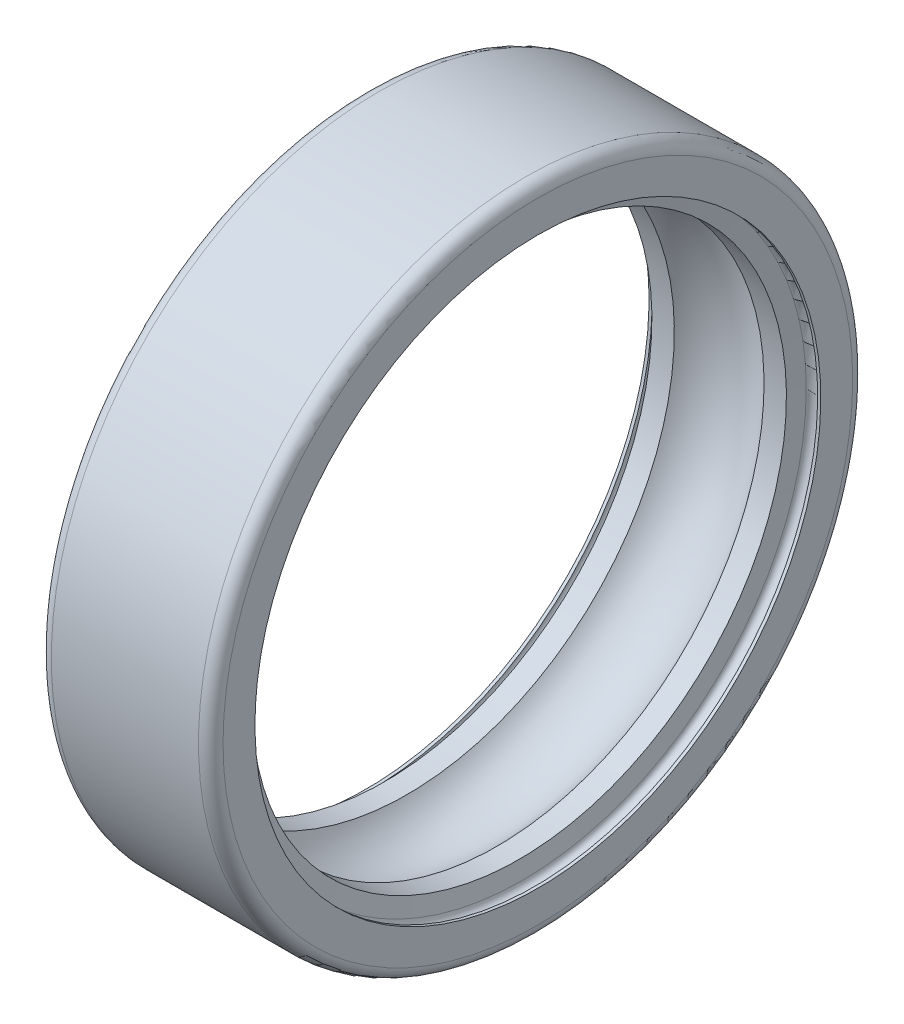
ISO-10303-21;
HEADER;
FILE_DESCRIPTION(('STEP AP214'),'2;1');
FILE_NAME('part.step','',(''),(''),'','','');
FILE_SCHEMA(('AUTOMOTIVE_DESIGN { 1 0 10303 214 1 1 1 1 }'));
ENDSEC;
DATA;
#1=APPLICATION_CONTEXT('core data for automotive mechanical design processes');
#2=APPLICATION_PROTOCOL_DEFINITION('international standard','automotive_design',2000,#1);
#3=PRODUCT_CONTEXT('',#1,'mechanical');
#4=PRODUCT('Part','Part','',(#3));
#5=PRODUCT_RELATED_PRODUCT_CATEGORY('part','',(#4));
#6=PRODUCT_DEFINITION_FORMATION('','',#4);
#7=PRODUCT_DEFINITION_CONTEXT('part definition',#1,'design');
#8=PRODUCT_DEFINITION('design','',#6,#7);
#9=PRODUCT_DEFINITION_SHAPE('','',#8);
#10=(LENGTH_UNIT() NAMED_UNIT(*) SI_UNIT(.MILLI.,.METRE.));
#11=(NAMED_UNIT(*) PLANE_ANGLE_UNIT() SI_UNIT($,.RADIAN.));
#12=(NAMED_UNIT(*) SI_UNIT($,.STERADIAN.) SOLID_ANGLE_UNIT());
#13=UNCERTAINTY_MEASURE_WITH_UNIT(LENGTH_MEASURE(1.E-05),#10,'distance_accuracy_value','');
#14=(GEOMETRIC_REPRESENTATION_CONTEXT(3) GLOBAL_UNCERTAINTY_ASSIGNED_CONTEXT((#13)) GLOBAL_UNIT_ASSIGNED_CONTEXT((#10,
#11,#12)) REPRESENTATION_CONTEXT('',''));
#15=CARTESIAN_POINT('',(0.,0.,0.));
#16=DIRECTION('',(0.,0.,1.));
#17=DIRECTION('',(1.,0.,0.));
#18=AXIS2_PLACEMENT_3D('',#15,#16,#17);
#19=CARTESIAN_POINT('',(19.845,0.,0.));
#20=DIRECTION('',(1.,0.,0.));
#21=DIRECTION('',(0.,0.,-1.));
#22=AXIS2_PLACEMENT_3D('',#19,#20,#21);
#23=TOROIDAL_SURFACE('',#22,34.6,0.77);
#24=CARTESIAN_POINT('',(20.615,0.,0.));
#25=DIRECTION('',(1.,0.,0.));
#26=DIRECTION('',(0.,1.,0.));
#27=AXIS2_PLACEMENT_3D('',#24,#25,#26);
#28=CIRCLE('',#27,34.6);
#29=CARTESIAN_POINT('',(20.615,34.6,0.));
#30=VERTEX_POINT('',#29);
#31=EDGE_CURVE('E11',#30,#30,#28,.T.);
#32=ORIENTED_EDGE('',*,*,#31,.T.);
#33=EDGE_LOOP('',(#32));
#34=FACE_BOUND('',#33,.T.);
#35=CARTESIAN_POINT('',(19.0866980301806,0.,0.));
#36=DIRECTION('',(1.,0.,0.));
#37=DIRECTION('',(0.,1.,0.));
#38=AXIS2_PLACEMENT_3D('',#35,#36,#37);
#39=CIRCLE('',#38,34.7337090968036);
#40=CARTESIAN_POINT('',(19.0866980301806,34.7337090968036,0.));
#41=VERTEX_POINT('',#40);
#42=EDGE_CURVE('E67',#41,#41,#39,.T.);
#43=ORIENTED_EDGE('',*,*,#42,.F.);
#44=EDGE_LOOP('',(#43));
#45=FACE_BOUND('',#44,.T.);
#46=ADVANCED_FACE('F17',(#34,#45),#23,.F.);
#47=CARTESIAN_POINT('',(20.8075,0.,0.));
#48=DIRECTION('',(-1.,0.,0.));
#49=DIRECTION('',(0.,1.,0.));
#50=AXIS2_PLACEMENT_3D('',#47,#48,#49);
#51=CYLINDRICAL_SURFACE('',#50,34.6);
#52=CARTESIAN_POINT('',(21.,0.,0.));
#53=DIRECTION('',(1.,0.,0.));
#54=DIRECTION('',(0.,1.,0.));
#55=AXIS2_PLACEMENT_3D('',#52,#53,#54);
#56=CIRCLE('',#55,34.6);
#57=CARTESIAN_POINT('',(21.,34.6,0.));
#58=VERTEX_POINT('',#57);
#59=EDGE_CURVE('E27',#58,#58,#56,.T.);
#60=ORIENTED_EDGE('',*,*,#59,.T.);
#61=EDGE_LOOP('',(#60));
#62=FACE_BOUND('',#61,.T.);
#63=ORIENTED_EDGE('',*,*,#31,.F.);
#64=EDGE_LOOP('',(#63));
#65=FACE_BOUND('',#64,.T.);
#66=ADVANCED_FACE('F114',(#62,#65),#51,.F.);
#67=CARTESIAN_POINT('',(21.,36.55,0.));
#68=DIRECTION('',(1.,0.,0.));
#69=DIRECTION('',(0.,1.,0.));
#70=AXIS2_PLACEMENT_3D('',#67,#68,#69);
#71=PLANE('',#70);
#72=CARTESIAN_POINT('',(21.,0.,0.));
#73=DIRECTION('',(1.,0.,0.));
#74=DIRECTION('',(0.,1.,0.));
#75=AXIS2_PLACEMENT_3D('',#72,#73,#74);
#76=CIRCLE('',#75,38.5);
#77=CARTESIAN_POINT('',(21.,38.5,0.));
#78=VERTEX_POINT('',#77);
#79=EDGE_CURVE('E72',#78,#78,#76,.T.);
#80=ORIENTED_EDGE('',*,*,#79,.T.);
#81=EDGE_LOOP('',(#80));
#82=FACE_BOUND('',#81,.T.);
#83=ORIENTED_EDGE('',*,*,#59,.F.);
#84=EDGE_LOOP('',(#83));
#85=FACE_BOUND('',#84,.T.);
#86=ADVANCED_FACE('F119',(#82,#85),#71,.T.);
#87=CARTESIAN_POINT('',(19.5,0.,0.));
#88=DIRECTION('',(1.,0.,0.));
#89=DIRECTION('',(0.,0.,-1.));
#90=AXIS2_PLACEMENT_3D('',#87,#88,#89);
#91=TOROIDAL_SURFACE('',#90,38.5,1.5);
#92=CARTESIAN_POINT('',(19.5,0.,0.));
#93=DIRECTION('',(1.,0.,0.));
#94=DIRECTION('',(0.,1.,0.));
#95=AXIS2_PLACEMENT_3D('',#92,#93,#94);
#96=CIRCLE('',#95,40.);
#97=CARTESIAN_POINT('',(19.5,40.,0.));
#98=VERTEX_POINT('',#97);
#99=EDGE_CURVE('E86',#98,#98,#96,.T.);
#100=ORIENTED_EDGE('',*,*,#99,.T.);
#101=EDGE_LOOP('',(#100));
#102=FACE_BOUND('',#101,.T.);
#103=ORIENTED_EDGE('',*,*,#79,.F.);
#104=EDGE_LOOP('',(#103));
#105=FACE_BOUND('',#104,.T.);
#106=ADVANCED_FACE('F109',(#102,#105),#91,.T.);
#107=CARTESIAN_POINT('',(10.5,0.,0.));
#108=DIRECTION('',(-1.,0.,0.));
#109=DIRECTION('',(0.,1.,0.));
#110=AXIS2_PLACEMENT_3D('',#107,#108,#109);
#111=CYLINDRICAL_SURFACE('',#110,40.);
#112=CARTESIAN_POINT('',(1.5,0.,0.));
#113=DIRECTION('',(1.,0.,0.));
#114=DIRECTION('',(0.,1.,0.));
#115=AXIS2_PLACEMENT_3D('',#112,#113,#114);
#116=CIRCLE('',#115,40.);
#117=CARTESIAN_POINT('',(1.5,40.,0.));
#118=VERTEX_POINT('',#117);
#119=EDGE_CURVE('E88',#118,#118,#116,.T.);
#120=ORIENTED_EDGE('',*,*,#119,.T.);
#121=EDGE_LOOP('',(#120));
#122=FACE_BOUND('',#121,.T.);
#123=ORIENTED_EDGE('',*,*,#99,.F.);
#124=EDGE_LOOP('',(#123));
#125=FACE_BOUND('',#124,.T.);
#126=ADVANCED_FACE('F94',(#122,#125),#111,.T.);
#127=CARTESIAN_POINT('',(1.5,0.,0.));
#128=DIRECTION('',(1.,0.,0.));
#129=DIRECTION('',(0.,0.,-1.));
#130=AXIS2_PLACEMENT_3D('',#127,#128,#129);
#131=TOROIDAL_SURFACE('',#130,38.5,1.5);
#132=CARTESIAN_POINT('',(0.,0.,0.));
#133=DIRECTION('',(1.,0.,0.));
#134=DIRECTION('',(0.,1.,0.));
#135=AXIS2_PLACEMENT_3D('',#132,#133,#134);
#136=CIRCLE('',#135,38.5);
#137=CARTESIAN_POINT('',(0.,38.5,0.));
#138=VERTEX_POINT('',#137);
#139=EDGE_CURVE('E89',#138,#138,#136,.T.);
#140=ORIENTED_EDGE('',*,*,#139,.T.);
#141=EDGE_LOOP('',(#140));
#142=FACE_BOUND('',#141,.T.);
#143=ORIENTED_EDGE('',*,*,#119,.F.);
#144=EDGE_LOOP('',(#143));
#145=FACE_BOUND('',#144,.T.);
#146=ADVANCED_FACE('F97',(#142,#145),#131,.T.);
#147=CARTESIAN_POINT('',(0.,36.55,0.));
#148=DIRECTION('',(-1.,0.,0.));
#149=DIRECTION('',(0.,-1.,0.));
#150=AXIS2_PLACEMENT_3D('',#147,#148,#149);
#151=PLANE('',#150);
#152=CARTESIAN_POINT('',(0.,0.,0.));
#153=DIRECTION('',(1.,0.,0.));
#154=DIRECTION('',(0.,1.,0.));
#155=AXIS2_PLACEMENT_3D('',#152,#153,#154);
#156=CIRCLE('',#155,34.6);
#157=CARTESIAN_POINT('',(0.,34.6,0.));
#158=VERTEX_POINT('',#157);
#159=EDGE_CURVE('E90',#158,#158,#156,.T.);
#160=ORIENTED_EDGE('',*,*,#159,.T.);
#161=EDGE_LOOP('',(#160));
#162=FACE_BOUND('',#161,.T.);
#163=ORIENTED_EDGE('',*,*,#139,.F.);
#164=EDGE_LOOP('',(#163));
#165=FACE_BOUND('',#164,.T.);
#166=ADVANCED_FACE('F99',(#162,#165),#151,.T.);
#167=CARTESIAN_POINT('',(0.1925,0.,0.));
#168=DIRECTION('',(-1.,0.,0.));
#169=DIRECTION('',(0.,1.,0.));
#170=AXIS2_PLACEMENT_3D('',#167,#168,#169);
#171=CYLINDRICAL_SURFACE('',#170,34.6);
#172=CARTESIAN_POINT('',(0.385,0.,0.));
#173=DIRECTION('',(1.,0.,0.));
#174=DIRECTION('',(0.,1.,0.));
#175=AXIS2_PLACEMENT_3D('',#172,#173,#174);
#176=CIRCLE('',#175,34.6);
#177=CARTESIAN_POINT('',(0.385,34.6,0.));
#178=VERTEX_POINT('',#177);
#179=EDGE_CURVE('E21',#178,#178,#176,.T.);
#180=ORIENTED_EDGE('',*,*,#179,.T.);
#181=EDGE_LOOP('',(#180));
#182=FACE_BOUND('',#181,.T.);
#183=ORIENTED_EDGE('',*,*,#159,.F.);
#184=EDGE_LOOP('',(#183));
#185=FACE_BOUND('',#184,.T.);
#186=ADVANCED_FACE('F107',(#182,#185),#171,.F.);
#187=CARTESIAN_POINT('',(1.155,0.,0.));
#188=DIRECTION('',(1.,0.,0.));
#189=DIRECTION('',(0.,0.,-1.));
#190=AXIS2_PLACEMENT_3D('',#187,#188,#189);
#191=TOROIDAL_SURFACE('',#190,34.6,0.77);
#192=CARTESIAN_POINT('',(1.91330196981941,0.,0.));
#193=DIRECTION('',(1.,0.,0.));
#194=DIRECTION('',(0.,1.,0.));
#195=AXIS2_PLACEMENT_3D('',#192,#193,#194);
#196=CIRCLE('',#195,34.7337090968036);
#197=CARTESIAN_POINT('',(1.91330196981941,34.7337090968036,0.));
#198=VERTEX_POINT('',#197);
#199=EDGE_CURVE('E78',#198,#198,#196,.T.);
#200=ORIENTED_EDGE('',*,*,#199,.T.);
#201=EDGE_LOOP('',(#200));
#202=FACE_BOUND('',#201,.T.);
#203=ORIENTED_EDGE('',*,*,#179,.F.);
#204=EDGE_LOOP('',(#203));
#205=FACE_BOUND('',#204,.T.);
#206=ADVANCED_FACE('F19',(#202,#205),#191,.F.);
#207=CARTESIAN_POINT('',(2.09480494941762,0.,0.));
#208=DIRECTION('',(-1.,0.,0.));
#209=DIRECTION('',(0.,1.,0.));
#210=AXIS2_PLACEMENT_3D('',#207,#208,#209);
#211=CONICAL_SURFACE('',#210,33.7043545484017,1.39626340159546);
#212=CARTESIAN_POINT('',(2.27630792901582,0.,0.));
#213=DIRECTION('',(1.,0.,0.));
#214=DIRECTION('',(0.,1.,0.));
#215=AXIS2_PLACEMENT_3D('',#212,#213,#214);
#216=CIRCLE('',#215,32.675);
#217=CARTESIAN_POINT('',(2.27630792901583,32.675,0.));
#218=VERTEX_POINT('',#217);
#219=EDGE_CURVE('E75',#218,#218,#216,.T.);
#220=ORIENTED_EDGE('',*,*,#219,.T.);
#221=EDGE_LOOP('',(#220));
#222=FACE_BOUND('',#221,.T.);
#223=ORIENTED_EDGE('',*,*,#199,.F.);
#224=EDGE_LOOP('',(#223));
#225=FACE_BOUND('',#224,.T.);
#226=ADVANCED_FACE('F124',(#222,#225),#211,.F.);
#227=CARTESIAN_POINT('',(3.64423414060634,0.,0.));
#228=DIRECTION('',(-1.,0.,0.));
#229=DIRECTION('',(0.,1.,0.));
#230=AXIS2_PLACEMENT_3D('',#227,#228,#229);
#231=CYLINDRICAL_SURFACE('',#230,32.675);
#232=CARTESIAN_POINT('',(5.01216035219687,0.,0.));
#233=DIRECTION('',(1.,0.,0.));
#234=DIRECTION('',(0.,1.,0.));
#235=AXIS2_PLACEMENT_3D('',#232,#233,#234);
#236=CIRCLE('',#235,32.675);
#237=CARTESIAN_POINT('',(5.01216035219687,32.675,0.));
#238=VERTEX_POINT('',#237);
#239=EDGE_CURVE('E79',#238,#238,#236,.T.);
#240=ORIENTED_EDGE('',*,*,#239,.T.);
#241=EDGE_LOOP('',(#240));
#242=FACE_BOUND('',#241,.T.);
#243=ORIENTED_EDGE('',*,*,#219,.F.);
#244=EDGE_LOOP('',(#243));
#245=FACE_BOUND('',#244,.T.);
#246=ADVANCED_FACE('F146',(#242,#245),#231,.F.);
#247=CARTESIAN_POINT('',(10.5,0.,0.));
#248=DIRECTION('',(1.,0.,0.));
#249=DIRECTION('',(0.,0.,-1.));
#250=AXIS2_PLACEMENT_3D('',#247,#248,#249);
#251=TOROIDAL_SURFACE('',#250,28.75,6.747);
#252=CARTESIAN_POINT('',(15.9878396478032,0.,0.));
#253=DIRECTION('',(1.,0.,0.));
#254=DIRECTION('',(0.,1.,0.));
#255=AXIS2_PLACEMENT_3D('',#252,#253,#254);
#256=CIRCLE('',#255,32.675);
#257=CARTESIAN_POINT('',(15.9878396478032,32.675,0.));
#258=VERTEX_POINT('',#257);
#259=EDGE_CURVE('E69',#258,#258,#256,.T.);
#260=ORIENTED_EDGE('',*,*,#259,.T.);
#261=EDGE_LOOP('',(#260));
#262=FACE_BOUND('',#261,.T.);
#263=ORIENTED_EDGE('',*,*,#239,.F.);
#264=EDGE_LOOP('',(#263));
#265=FACE_BOUND('',#264,.T.);
#266=ADVANCED_FACE('F153',(#262,#265),#251,.F.);
#267=CARTESIAN_POINT('',(17.3557658593936,0.,0.));
#268=DIRECTION('',(-1.,0.,0.));
#269=DIRECTION('',(0.,1.,0.));
#270=AXIS2_PLACEMENT_3D('',#267,#268,#269);
#271=CYLINDRICAL_SURFACE('',#270,32.675);
#272=CARTESIAN_POINT('',(18.7236920709842,0.,0.));
#273=DIRECTION('',(1.,0.,0.));
#274=DIRECTION('',(0.,1.,0.));
#275=AXIS2_PLACEMENT_3D('',#272,#273,#274);
#276=CIRCLE('',#275,32.675);
#277=CARTESIAN_POINT('',(18.7236920709842,32.675,0.));
#278=VERTEX_POINT('',#277);
#279=EDGE_CURVE('E63',#278,#278,#276,.T.);
#280=ORIENTED_EDGE('',*,*,#279,.T.);
#281=EDGE_LOOP('',(#280));
#282=FACE_BOUND('',#281,.T.);
#283=ORIENTED_EDGE('',*,*,#259,.F.);
#284=EDGE_LOOP('',(#283));
#285=FACE_BOUND('',#284,.T.);
#286=ADVANCED_FACE('F64',(#282,#285),#271,.F.);
#287=CARTESIAN_POINT('',(18.9051950505824,0.,0.));
#288=DIRECTION('',(1.,0.,0.));
#289=DIRECTION('',(0.,1.,0.));
#290=AXIS2_PLACEMENT_3D('',#287,#288,#289);
#291=CONICAL_SURFACE('',#290,33.7043545484017,1.39626340159547);
#292=ORIENTED_EDGE('',*,*,#42,.T.);
#293=EDGE_LOOP('',(#292));
#294=FACE_BOUND('',#293,.T.);
#295=ORIENTED_EDGE('',*,*,#279,.F.);
#296=EDGE_LOOP('',(#295));
#297=FACE_BOUND('',#296,.T.);
#298=ADVANCED_FACE('F147',(#294,#297),#291,.F.);
#299=CLOSED_SHELL('',(#46,#66,#86,#106,#126,#146,#166,#186,#206,#226,#246,#266,#286,#298));
#300=MANIFOLD_SOLID_BREP('B1',#299);
#301=ADVANCED_BREP_SHAPE_REPRESENTATION('',(#18,#300),#14);
#302=SHAPE_DEFINITION_REPRESENTATION(#9,#301);
ENDSEC;
END-ISO-10303-21;
